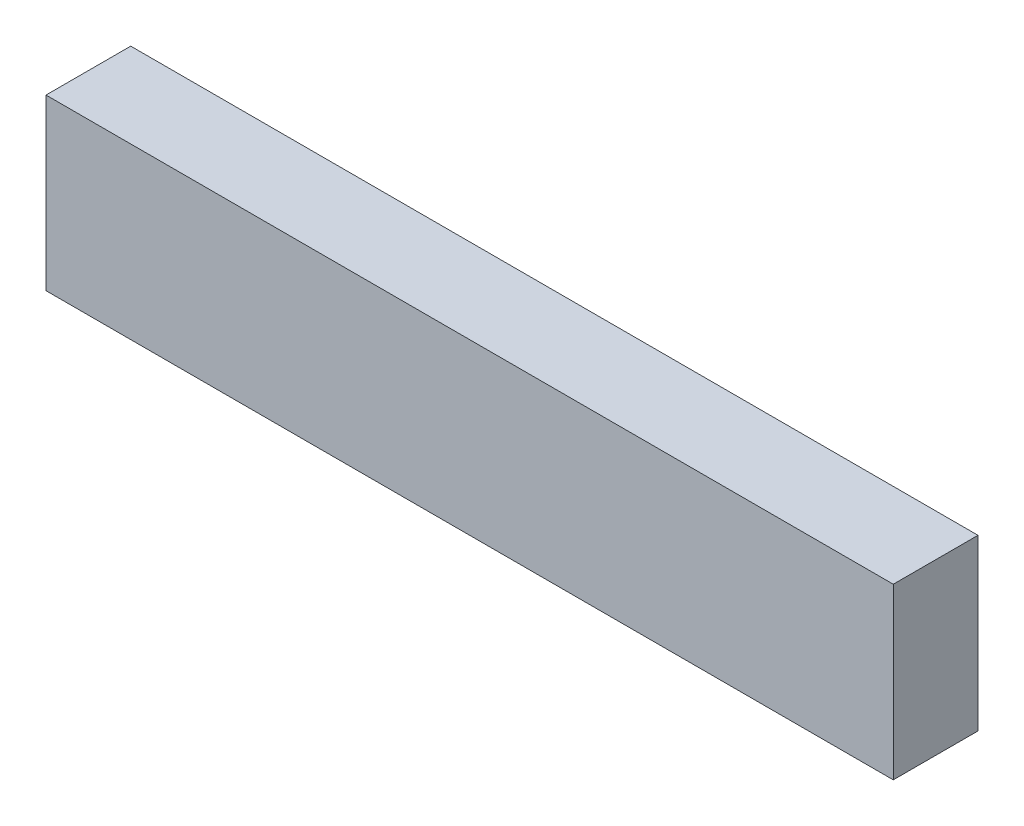
ISO-10303-21;
HEADER;
FILE_DESCRIPTION(('STEP AP214'),'2;1');
FILE_NAME('part.step','',(''),(''),'','','');
FILE_SCHEMA(('AUTOMOTIVE_DESIGN { 1 0 10303 214 1 1 1 1 }'));
ENDSEC;
DATA;
#1=APPLICATION_CONTEXT('core data for automotive mechanical design processes');
#2=APPLICATION_PROTOCOL_DEFINITION('international standard','automotive_design',2000,#1);
#3=PRODUCT_CONTEXT('',#1,'mechanical');
#4=PRODUCT('Part','Part','',(#3));
#5=PRODUCT_RELATED_PRODUCT_CATEGORY('part','',(#4));
#6=PRODUCT_DEFINITION_FORMATION('','',#4);
#7=PRODUCT_DEFINITION_CONTEXT('part definition',#1,'design');
#8=PRODUCT_DEFINITION('design','',#6,#7);
#9=PRODUCT_DEFINITION_SHAPE('','',#8);
#10=(LENGTH_UNIT() NAMED_UNIT(*) SI_UNIT(.MILLI.,.METRE.));
#11=(NAMED_UNIT(*) PLANE_ANGLE_UNIT() SI_UNIT($,.RADIAN.));
#12=(NAMED_UNIT(*) SI_UNIT($,.STERADIAN.) SOLID_ANGLE_UNIT());
#13=UNCERTAINTY_MEASURE_WITH_UNIT(LENGTH_MEASURE(1.E-05),#10,'distance_accuracy_value','');
#14=(GEOMETRIC_REPRESENTATION_CONTEXT(3) GLOBAL_UNCERTAINTY_ASSIGNED_CONTEXT((#13)) GLOBAL_UNIT_ASSIGNED_CONTEXT((#10,
#11,#12)) REPRESENTATION_CONTEXT('',''));
#15=CARTESIAN_POINT('',(0.,0.,0.));
#16=DIRECTION('',(0.,0.,1.));
#17=DIRECTION('',(1.,0.,0.));
#18=AXIS2_PLACEMENT_3D('',#15,#16,#17);
#19=CARTESIAN_POINT('',(0.,0.,25.4));
#20=DIRECTION('',(1.,0.,0.));
#21=DIRECTION('',(0.,0.,-1.));
#22=AXIS2_PLACEMENT_3D('',#19,#20,#21);
#23=PLANE('',#22);
#24=DIRECTION('',(0.,-1.,0.));
#25=VECTOR('',#24,1.);
#26=CARTESIAN_POINT('',(0.,0.,0.));
#27=LINE('',#26,#25);
#28=CARTESIAN_POINT('',(0.,50.8,0.));
#29=VERTEX_POINT('',#28);
#30=CARTESIAN_POINT('',(0.,0.,0.));
#31=VERTEX_POINT('',#30);
#32=EDGE_CURVE('E84',#29,#31,#27,.T.);
#33=ORIENTED_EDGE('',*,*,#32,.T.);
#34=DIRECTION('',(0.,0.,-1.));
#35=VECTOR('',#34,1.);
#36=CARTESIAN_POINT('',(0.,0.,25.4));
#37=LINE('',#36,#35);
#38=CARTESIAN_POINT('',(0.,0.,25.4));
#39=VERTEX_POINT('',#38);
#40=EDGE_CURVE('E11',#39,#31,#37,.T.);
#41=ORIENTED_EDGE('',*,*,#40,.F.);
#42=DIRECTION('',(0.,-1.,0.));
#43=VECTOR('',#42,1.);
#44=CARTESIAN_POINT('',(0.,0.,25.4));
#45=LINE('',#44,#43);
#46=CARTESIAN_POINT('',(0.,50.8,25.4));
#47=VERTEX_POINT('',#46);
#48=EDGE_CURVE('E102',#47,#39,#45,.T.);
#49=ORIENTED_EDGE('',*,*,#48,.F.);
#50=DIRECTION('',(0.,0.,-1.));
#51=VECTOR('',#50,1.);
#52=CARTESIAN_POINT('',(0.,50.8,25.4));
#53=LINE('',#52,#51);
#54=EDGE_CURVE('E96',#47,#29,#53,.T.);
#55=ORIENTED_EDGE('',*,*,#54,.T.);
#56=EDGE_LOOP('',(#33,#41,#49,#55));
#57=FACE_BOUND('',#56,.T.);
#58=ADVANCED_FACE('F40',(#57),#23,.F.);
#59=CARTESIAN_POINT('',(0.,0.,25.4));
#60=DIRECTION('',(0.,1.,0.));
#61=DIRECTION('',(0.,0.,1.));
#62=AXIS2_PLACEMENT_3D('',#59,#60,#61);
#63=PLANE('',#62);
#64=DIRECTION('',(1.,0.,0.));
#65=VECTOR('',#64,1.);
#66=CARTESIAN_POINT('',(0.,0.,0.));
#67=LINE('',#66,#65);
#68=CARTESIAN_POINT('',(254.,0.,0.));
#69=VERTEX_POINT('',#68);
#70=EDGE_CURVE('E80',#31,#69,#67,.T.);
#71=ORIENTED_EDGE('',*,*,#70,.T.);
#72=DIRECTION('',(0.,0.,-1.));
#73=VECTOR('',#72,1.);
#74=CARTESIAN_POINT('',(254.,0.,25.4));
#75=LINE('',#74,#73);
#76=CARTESIAN_POINT('',(254.,0.,25.4));
#77=VERTEX_POINT('',#76);
#78=EDGE_CURVE('E47',#77,#69,#75,.T.);
#79=ORIENTED_EDGE('',*,*,#78,.F.);
#80=DIRECTION('',(1.,0.,0.));
#81=VECTOR('',#80,1.);
#82=CARTESIAN_POINT('',(0.,0.,25.4));
#83=LINE('',#82,#81);
#84=EDGE_CURVE('E92',#39,#77,#83,.T.);
#85=ORIENTED_EDGE('',*,*,#84,.F.);
#86=ORIENTED_EDGE('',*,*,#40,.T.);
#87=EDGE_LOOP('',(#71,#79,#85,#86));
#88=FACE_BOUND('',#87,.T.);
#89=ADVANCED_FACE('F91',(#88),#63,.F.);
#90=CARTESIAN_POINT('',(254.,0.,25.4));
#91=DIRECTION('',(-1.,0.,0.));
#92=DIRECTION('',(0.,0.,1.));
#93=AXIS2_PLACEMENT_3D('',#90,#91,#92);
#94=PLANE('',#93);
#95=DIRECTION('',(0.,1.,0.));
#96=VECTOR('',#95,1.);
#97=CARTESIAN_POINT('',(254.,0.,0.));
#98=LINE('',#97,#96);
#99=CARTESIAN_POINT('',(254.,50.8,0.));
#100=VERTEX_POINT('',#99);
#101=EDGE_CURVE('E85',#69,#100,#98,.T.);
#102=ORIENTED_EDGE('',*,*,#101,.T.);
#103=DIRECTION('',(0.,0.,-1.));
#104=VECTOR('',#103,1.);
#105=CARTESIAN_POINT('',(254.,50.8,25.4));
#106=LINE('',#105,#104);
#107=CARTESIAN_POINT('',(254.,50.8,25.4));
#108=VERTEX_POINT('',#107);
#109=EDGE_CURVE('E108',#108,#100,#106,.T.);
#110=ORIENTED_EDGE('',*,*,#109,.F.);
#111=DIRECTION('',(0.,1.,0.));
#112=VECTOR('',#111,1.);
#113=CARTESIAN_POINT('',(254.,0.,25.4));
#114=LINE('',#113,#112);
#115=EDGE_CURVE('E59',#77,#108,#114,.T.);
#116=ORIENTED_EDGE('',*,*,#115,.F.);
#117=ORIENTED_EDGE('',*,*,#78,.T.);
#118=EDGE_LOOP('',(#102,#110,#116,#117));
#119=FACE_BOUND('',#118,.T.);
#120=ADVANCED_FACE('F111',(#119),#94,.F.);
#121=CARTESIAN_POINT('',(0.,50.8,25.4));
#122=DIRECTION('',(0.,-1.,0.));
#123=DIRECTION('',(0.,0.,-1.));
#124=AXIS2_PLACEMENT_3D('',#121,#122,#123);
#125=PLANE('',#124);
#126=DIRECTION('',(-1.,0.,0.));
#127=VECTOR('',#126,1.);
#128=CARTESIAN_POINT('',(0.,50.8,0.));
#129=LINE('',#128,#127);
#130=EDGE_CURVE('E100',#100,#29,#129,.T.);
#131=ORIENTED_EDGE('',*,*,#130,.T.);
#132=ORIENTED_EDGE('',*,*,#54,.F.);
#133=DIRECTION('',(-1.,0.,0.));
#134=VECTOR('',#133,1.);
#135=CARTESIAN_POINT('',(0.,50.8,25.4));
#136=LINE('',#135,#134);
#137=EDGE_CURVE('E54',#108,#47,#136,.T.);
#138=ORIENTED_EDGE('',*,*,#137,.F.);
#139=ORIENTED_EDGE('',*,*,#109,.T.);
#140=EDGE_LOOP('',(#131,#132,#138,#139));
#141=FACE_BOUND('',#140,.T.);
#142=ADVANCED_FACE('F113',(#141),#125,.F.);
#143=CARTESIAN_POINT('',(0.,50.8,25.4));
#144=DIRECTION('',(0.,0.,-1.));
#145=DIRECTION('',(-1.,0.,0.));
#146=AXIS2_PLACEMENT_3D('',#143,#144,#145);
#147=PLANE('',#146);
#148=ORIENTED_EDGE('',*,*,#48,.T.);
#149=ORIENTED_EDGE('',*,*,#84,.T.);
#150=ORIENTED_EDGE('',*,*,#115,.T.);
#151=ORIENTED_EDGE('',*,*,#137,.T.);
#152=EDGE_LOOP('',(#148,#149,#150,#151));
#153=FACE_BOUND('',#152,.T.);
#154=ADVANCED_FACE('F114',(#153),#147,.F.);
#155=CARTESIAN_POINT('',(0.,50.8,0.));
#156=DIRECTION('',(0.,0.,-1.));
#157=DIRECTION('',(-1.,0.,0.));
#158=AXIS2_PLACEMENT_3D('',#155,#156,#157);
#159=PLANE('',#158);
#160=ORIENTED_EDGE('',*,*,#32,.F.);
#161=ORIENTED_EDGE('',*,*,#130,.F.);
#162=ORIENTED_EDGE('',*,*,#101,.F.);
#163=ORIENTED_EDGE('',*,*,#70,.F.);
#164=EDGE_LOOP('',(#160,#161,#162,#163));
#165=FACE_BOUND('',#164,.T.);
#166=ADVANCED_FACE('F81',(#165),#159,.T.);
#167=CLOSED_SHELL('',(#58,#89,#120,#142,#154,#166));
#168=MANIFOLD_SOLID_BREP('B2',#167);
#169=ADVANCED_BREP_SHAPE_REPRESENTATION('',(#18,#168),#14);
#170=SHAPE_DEFINITION_REPRESENTATION(#9,#169);
ENDSEC;
END-ISO-10303-21;
